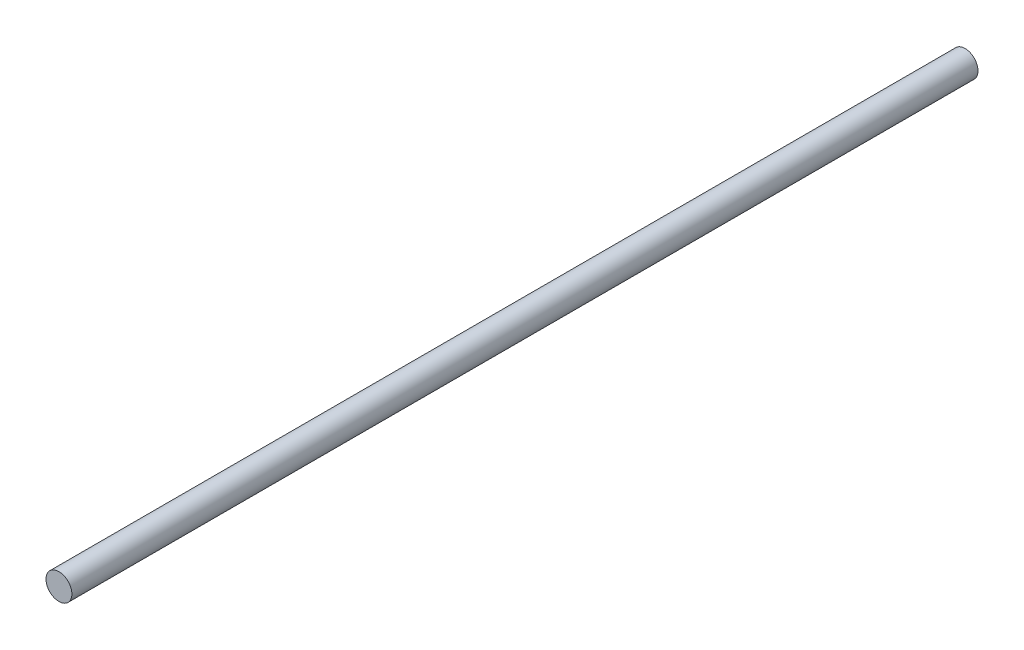
ISO-10303-21;
HEADER;
FILE_DESCRIPTION(('STEP AP214'),'2;1');
FILE_NAME('part.step','',(''),(''),'','','');
FILE_SCHEMA(('AUTOMOTIVE_DESIGN { 1 0 10303 214 1 1 1 1 }'));
ENDSEC;
DATA;
#1=APPLICATION_CONTEXT('core data for automotive mechanical design processes');
#2=APPLICATION_PROTOCOL_DEFINITION('international standard','automotive_design',2000,#1);
#3=PRODUCT_CONTEXT('',#1,'mechanical');
#4=PRODUCT('Part','Part','',(#3));
#5=PRODUCT_RELATED_PRODUCT_CATEGORY('part','',(#4));
#6=PRODUCT_DEFINITION_FORMATION('','',#4);
#7=PRODUCT_DEFINITION_CONTEXT('part definition',#1,'design');
#8=PRODUCT_DEFINITION('design','',#6,#7);
#9=PRODUCT_DEFINITION_SHAPE('','',#8);
#10=(LENGTH_UNIT() NAMED_UNIT(*) SI_UNIT(.MILLI.,.METRE.));
#11=(NAMED_UNIT(*) PLANE_ANGLE_UNIT() SI_UNIT($,.RADIAN.));
#12=(NAMED_UNIT(*) SI_UNIT($,.STERADIAN.) SOLID_ANGLE_UNIT());
#13=UNCERTAINTY_MEASURE_WITH_UNIT(LENGTH_MEASURE(1.E-05),#10,'distance_accuracy_value','');
#14=(GEOMETRIC_REPRESENTATION_CONTEXT(3) GLOBAL_UNCERTAINTY_ASSIGNED_CONTEXT((#13)) GLOBAL_UNIT_ASSIGNED_CONTEXT((#10,
#11,#12)) REPRESENTATION_CONTEXT('',''));
#15=CARTESIAN_POINT('',(0.,0.,0.));
#16=DIRECTION('',(0.,0.,1.));
#17=DIRECTION('',(1.,0.,0.));
#18=AXIS2_PLACEMENT_3D('',#15,#16,#17);
#19=CARTESIAN_POINT('',(0.,0.,-140.));
#20=DIRECTION('',(0.,0.,1.));
#21=DIRECTION('',(1.,0.,0.));
#22=AXIS2_PLACEMENT_3D('',#19,#20,#21);
#23=CYLINDRICAL_SURFACE('',#22,4.);
#24=CARTESIAN_POINT('',(0.,0.,-140.));
#25=DIRECTION('',(0.,0.,1.));
#26=DIRECTION('',(1.,0.,0.));
#27=AXIS2_PLACEMENT_3D('',#24,#25,#26);
#28=CIRCLE('',#27,4.);
#29=CARTESIAN_POINT('',(4.,0.,-140.));
#30=VERTEX_POINT('',#29);
#31=EDGE_CURVE('E10',#30,#30,#28,.T.);
#32=ORIENTED_EDGE('',*,*,#31,.T.);
#33=EDGE_LOOP('',(#32));
#34=FACE_BOUND('',#33,.T.);
#35=CARTESIAN_POINT('',(0.,0.,140.));
#36=DIRECTION('',(0.,0.,1.));
#37=DIRECTION('',(1.,0.,0.));
#38=AXIS2_PLACEMENT_3D('',#35,#36,#37);
#39=CIRCLE('',#38,4.);
#40=CARTESIAN_POINT('',(4.,0.,140.));
#41=VERTEX_POINT('',#40);
#42=EDGE_CURVE('E43',#41,#41,#39,.T.);
#43=ORIENTED_EDGE('',*,*,#42,.F.);
#44=EDGE_LOOP('',(#43));
#45=FACE_BOUND('',#44,.T.);
#46=ADVANCED_FACE('F40',(#34,#45),#23,.T.);
#47=CARTESIAN_POINT('',(0.,0.,-140.));
#48=DIRECTION('',(0.,0.,1.));
#49=DIRECTION('',(1.,0.,0.));
#50=AXIS2_PLACEMENT_3D('',#47,#48,#49);
#51=PLANE('',#50);
#52=ORIENTED_EDGE('',*,*,#31,.F.);
#53=EDGE_LOOP('',(#52));
#54=FACE_BOUND('',#53,.T.);
#55=ADVANCED_FACE('F55',(#54),#51,.F.);
#56=CARTESIAN_POINT('',(0.,0.,140.));
#57=DIRECTION('',(0.,0.,1.));
#58=DIRECTION('',(1.,0.,0.));
#59=AXIS2_PLACEMENT_3D('',#56,#57,#58);
#60=PLANE('',#59);
#61=ORIENTED_EDGE('',*,*,#42,.T.);
#62=EDGE_LOOP('',(#61));
#63=FACE_BOUND('',#62,.T.);
#64=ADVANCED_FACE('F47',(#63),#60,.T.);
#65=CLOSED_SHELL('',(#46,#55,#64));
#66=MANIFOLD_SOLID_BREP('B2',#65);
#67=ADVANCED_BREP_SHAPE_REPRESENTATION('',(#18,#66),#14);
#68=SHAPE_DEFINITION_REPRESENTATION(#9,#67);
ENDSEC;
END-ISO-10303-21;
